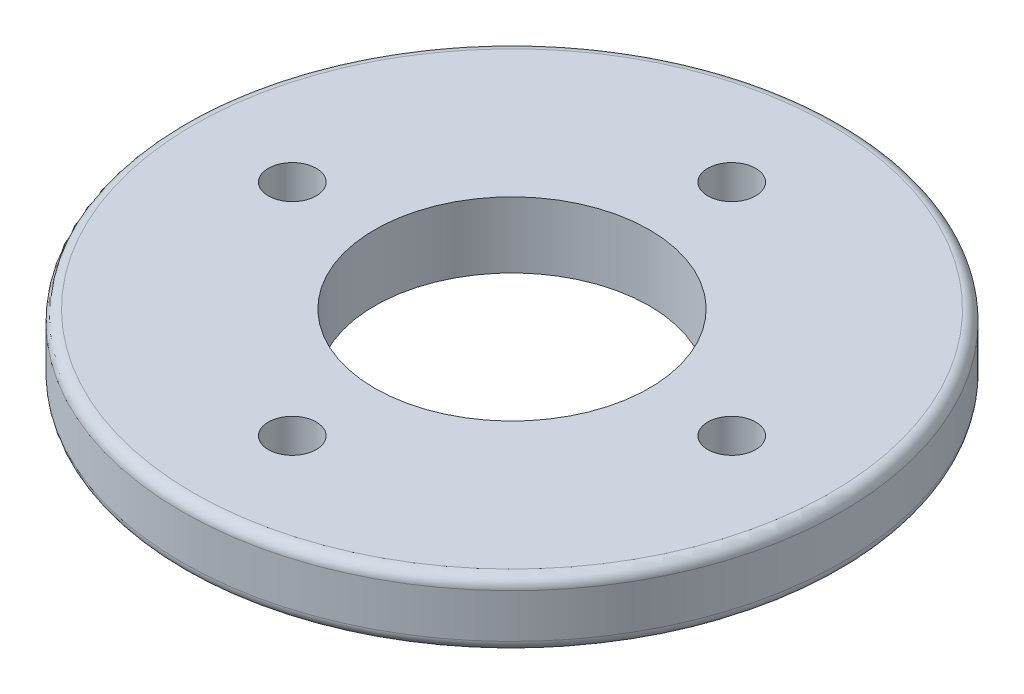
ISO-10303-21;
HEADER;
FILE_DESCRIPTION(('STEP AP214'),'2;1');
FILE_NAME('part.step','',(''),(''),'','','');
FILE_SCHEMA(('AUTOMOTIVE_DESIGN { 1 0 10303 214 1 1 1 1 }'));
ENDSEC;
DATA;
#1=APPLICATION_CONTEXT('core data for automotive mechanical design processes');
#2=APPLICATION_PROTOCOL_DEFINITION('international standard','automotive_design',2000,#1);
#3=PRODUCT_CONTEXT('',#1,'mechanical');
#4=PRODUCT('Part','Part','',(#3));
#5=PRODUCT_RELATED_PRODUCT_CATEGORY('part','',(#4));
#6=PRODUCT_DEFINITION_FORMATION('','',#4);
#7=PRODUCT_DEFINITION_CONTEXT('part definition',#1,'design');
#8=PRODUCT_DEFINITION('design','',#6,#7);
#9=PRODUCT_DEFINITION_SHAPE('','',#8);
#10=(LENGTH_UNIT() NAMED_UNIT(*) SI_UNIT(.MILLI.,.METRE.));
#11=(NAMED_UNIT(*) PLANE_ANGLE_UNIT() SI_UNIT($,.RADIAN.));
#12=(NAMED_UNIT(*) SI_UNIT($,.STERADIAN.) SOLID_ANGLE_UNIT());
#13=UNCERTAINTY_MEASURE_WITH_UNIT(LENGTH_MEASURE(1.E-05),#10,'distance_accuracy_value','');
#14=(GEOMETRIC_REPRESENTATION_CONTEXT(3) GLOBAL_UNCERTAINTY_ASSIGNED_CONTEXT((#13)) GLOBAL_UNIT_ASSIGNED_CONTEXT((#10,
#11,#12)) REPRESENTATION_CONTEXT('',''));
#15=CARTESIAN_POINT('',(0.,0.,0.));
#16=DIRECTION('',(0.,0.,1.));
#17=DIRECTION('',(1.,0.,0.));
#18=AXIS2_PLACEMENT_3D('',#15,#16,#17);
#19=CARTESIAN_POINT('',(0.,3.,0.));
#20=DIRECTION('',(0.,-1.,0.));
#21=DIRECTION('',(0.,0.,-1.));
#22=AXIS2_PLACEMENT_3D('',#19,#20,#21);
#23=CYLINDRICAL_SURFACE('',#22,15.);
#24=CARTESIAN_POINT('',(0.,0.5,0.));
#25=DIRECTION('',(0.,1.,0.));
#26=DIRECTION('',(0.,0.,1.));
#27=AXIS2_PLACEMENT_3D('',#24,#25,#26);
#28=CIRCLE('',#27,15.);
#29=CARTESIAN_POINT('',(0.,0.5,15.));
#30=VERTEX_POINT('',#29);
#31=EDGE_CURVE('E43',#30,#30,#28,.T.);
#32=ORIENTED_EDGE('',*,*,#31,.T.);
#33=EDGE_LOOP('',(#32));
#34=FACE_BOUND('',#33,.T.);
#35=CARTESIAN_POINT('',(0.,2.5,0.));
#36=DIRECTION('',(0.,1.,0.));
#37=DIRECTION('',(0.,0.,1.));
#38=AXIS2_PLACEMENT_3D('',#35,#36,#37);
#39=CIRCLE('',#38,15.);
#40=CARTESIAN_POINT('',(0.,2.5,15.));
#41=VERTEX_POINT('',#40);
#42=EDGE_CURVE('E48',#41,#41,#39,.F.);
#43=ORIENTED_EDGE('',*,*,#42,.T.);
#44=EDGE_LOOP('',(#43));
#45=FACE_BOUND('',#44,.T.);
#46=ADVANCED_FACE('F31',(#34,#45),#23,.T.);
#47=CARTESIAN_POINT('',(0.,3.,0.));
#48=DIRECTION('',(0.,1.,0.));
#49=DIRECTION('',(0.,0.,1.));
#50=AXIS2_PLACEMENT_3D('',#47,#48,#49);
#51=PLANE('',#50);
#52=CARTESIAN_POINT('',(0.,3.,0.));
#53=DIRECTION('',(0.,1.,0.));
#54=DIRECTION('',(0.,0.,1.));
#55=AXIS2_PLACEMENT_3D('',#52,#53,#54);
#56=CIRCLE('',#55,6.25);
#57=CARTESIAN_POINT('',(0.,3.,6.25));
#58=VERTEX_POINT('',#57);
#59=EDGE_CURVE('E75',#58,#58,#56,.T.);
#60=ORIENTED_EDGE('',*,*,#59,.F.);
#61=EDGE_LOOP('',(#60));
#62=FACE_BOUND('',#61,.T.);
#63=CARTESIAN_POINT('',(0.,3.,0.));
#64=DIRECTION('',(0.,1.,0.));
#65=DIRECTION('',(0.,0.,1.));
#66=AXIS2_PLACEMENT_3D('',#63,#64,#65);
#67=CIRCLE('',#66,14.5);
#68=CARTESIAN_POINT('',(0.,3.,14.5));
#69=VERTEX_POINT('',#68);
#70=EDGE_CURVE('E10',#69,#69,#67,.T.);
#71=ORIENTED_EDGE('',*,*,#70,.T.);
#72=EDGE_LOOP('',(#71));
#73=FACE_BOUND('',#72,.T.);
#74=CARTESIAN_POINT('',(10.,3.,-1.04744440165294E-13));
#75=DIRECTION('',(0.,1.,0.));
#76=DIRECTION('',(-1.,0.,0.));
#77=AXIS2_PLACEMENT_3D('',#74,#75,#76);
#78=CIRCLE('',#77,1.09);
#79=CARTESIAN_POINT('',(8.91,3.,0.));
#80=VERTEX_POINT('',#79);
#81=EDGE_CURVE('E69',#80,#80,#78,.T.);
#82=ORIENTED_EDGE('',*,*,#81,.F.);
#83=EDGE_LOOP('',(#82));
#84=FACE_BOUND('',#83,.T.);
#85=CARTESIAN_POINT('',(0.,3.,10.));
#86=DIRECTION('',(0.,1.,0.));
#87=DIRECTION('',(0.,0.,-1.));
#88=AXIS2_PLACEMENT_3D('',#85,#86,#87);
#89=CIRCLE('',#88,1.09);
#90=CARTESIAN_POINT('',(0.,3.,8.91));
#91=VERTEX_POINT('',#90);
#92=EDGE_CURVE('E63',#91,#91,#89,.T.);
#93=ORIENTED_EDGE('',*,*,#92,.F.);
#94=EDGE_LOOP('',(#93));
#95=FACE_BOUND('',#94,.T.);
#96=CARTESIAN_POINT('',(-10.,3.,0.));
#97=DIRECTION('',(0.,1.,0.));
#98=DIRECTION('',(1.,0.,0.));
#99=AXIS2_PLACEMENT_3D('',#96,#97,#98);
#100=CIRCLE('',#99,1.09);
#101=CARTESIAN_POINT('',(-8.91,3.,0.));
#102=VERTEX_POINT('',#101);
#103=EDGE_CURVE('E57',#102,#102,#100,.T.);
#104=ORIENTED_EDGE('',*,*,#103,.F.);
#105=EDGE_LOOP('',(#104));
#106=FACE_BOUND('',#105,.T.);
#107=CARTESIAN_POINT('',(0.,3.,-10.));
#108=DIRECTION('',(0.,1.,0.));
#109=DIRECTION('',(0.,0.,1.));
#110=AXIS2_PLACEMENT_3D('',#107,#108,#109);
#111=CIRCLE('',#110,1.09);
#112=CARTESIAN_POINT('',(0.,3.,-8.91));
#113=VERTEX_POINT('',#112);
#114=EDGE_CURVE('E54',#113,#113,#111,.T.);
#115=ORIENTED_EDGE('',*,*,#114,.F.);
#116=EDGE_LOOP('',(#115));
#117=FACE_BOUND('',#116,.T.);
#118=ADVANCED_FACE('F95',(#62,#73,#84,#95,#106,#117),#51,.T.);
#119=CARTESIAN_POINT('',(0.,0.,0.));
#120=DIRECTION('',(0.,1.,0.));
#121=DIRECTION('',(0.,0.,1.));
#122=AXIS2_PLACEMENT_3D('',#119,#120,#121);
#123=PLANE('',#122);
#124=CARTESIAN_POINT('',(0.,0.,0.));
#125=DIRECTION('',(0.,1.,0.));
#126=DIRECTION('',(0.,0.,1.));
#127=AXIS2_PLACEMENT_3D('',#124,#125,#126);
#128=CIRCLE('',#127,6.25);
#129=CARTESIAN_POINT('',(0.,0.,6.25));
#130=VERTEX_POINT('',#129);
#131=EDGE_CURVE('E35',#130,#130,#128,.T.);
#132=ORIENTED_EDGE('',*,*,#131,.T.);
#133=EDGE_LOOP('',(#132));
#134=FACE_BOUND('',#133,.T.);
#135=CARTESIAN_POINT('',(0.,0.,0.));
#136=DIRECTION('',(0.,1.,0.));
#137=DIRECTION('',(0.,0.,1.));
#138=AXIS2_PLACEMENT_3D('',#135,#136,#137);
#139=CIRCLE('',#138,14.5);
#140=CARTESIAN_POINT('',(0.,0.,14.5));
#141=VERTEX_POINT('',#140);
#142=EDGE_CURVE('E39',#141,#141,#139,.F.);
#143=ORIENTED_EDGE('',*,*,#142,.T.);
#144=EDGE_LOOP('',(#143));
#145=FACE_BOUND('',#144,.T.);
#146=CARTESIAN_POINT('',(10.,0.,-1.04744440165294E-13));
#147=DIRECTION('',(0.,1.,0.));
#148=DIRECTION('',(-1.,0.,0.));
#149=AXIS2_PLACEMENT_3D('',#146,#147,#148);
#150=CIRCLE('',#149,1.09);
#151=CARTESIAN_POINT('',(8.91,0.,0.));
#152=VERTEX_POINT('',#151);
#153=EDGE_CURVE('E72',#152,#152,#150,.F.);
#154=ORIENTED_EDGE('',*,*,#153,.F.);
#155=EDGE_LOOP('',(#154));
#156=FACE_BOUND('',#155,.T.);
#157=CARTESIAN_POINT('',(0.,0.,10.));
#158=DIRECTION('',(0.,1.,0.));
#159=DIRECTION('',(0.,0.,-1.));
#160=AXIS2_PLACEMENT_3D('',#157,#158,#159);
#161=CIRCLE('',#160,1.09);
#162=CARTESIAN_POINT('',(0.,0.,8.91));
#163=VERTEX_POINT('',#162);
#164=EDGE_CURVE('E66',#163,#163,#161,.F.);
#165=ORIENTED_EDGE('',*,*,#164,.F.);
#166=EDGE_LOOP('',(#165));
#167=FACE_BOUND('',#166,.T.);
#168=CARTESIAN_POINT('',(-10.,0.,0.));
#169=DIRECTION('',(0.,1.,0.));
#170=DIRECTION('',(1.,0.,0.));
#171=AXIS2_PLACEMENT_3D('',#168,#169,#170);
#172=CIRCLE('',#171,1.09);
#173=CARTESIAN_POINT('',(-8.91,0.,0.));
#174=VERTEX_POINT('',#173);
#175=EDGE_CURVE('E60',#174,#174,#172,.F.);
#176=ORIENTED_EDGE('',*,*,#175,.F.);
#177=EDGE_LOOP('',(#176));
#178=FACE_BOUND('',#177,.T.);
#179=CARTESIAN_POINT('',(0.,0.,-10.));
#180=DIRECTION('',(0.,1.,0.));
#181=DIRECTION('',(0.,0.,1.));
#182=AXIS2_PLACEMENT_3D('',#179,#180,#181);
#183=CIRCLE('',#182,1.09);
#184=CARTESIAN_POINT('',(0.,0.,-8.91));
#185=VERTEX_POINT('',#184);
#186=EDGE_CURVE('E51',#185,#185,#183,.F.);
#187=ORIENTED_EDGE('',*,*,#186,.F.);
#188=EDGE_LOOP('',(#187));
#189=FACE_BOUND('',#188,.T.);
#190=ADVANCED_FACE('F82',(#134,#145,#156,#167,#178,#189),#123,.F.);
#191=CARTESIAN_POINT('',(0.,-3.08298556597335,-10.));
#192=DIRECTION('',(0.,1.,0.));
#193=DIRECTION('',(0.,0.,1.));
#194=AXIS2_PLACEMENT_3D('',#191,#192,#193);
#195=CYLINDRICAL_SURFACE('',#194,1.09);
#196=ORIENTED_EDGE('',*,*,#186,.T.);
#197=EDGE_LOOP('',(#196));
#198=FACE_BOUND('',#197,.T.);
#199=ORIENTED_EDGE('',*,*,#114,.T.);
#200=EDGE_LOOP('',(#199));
#201=FACE_BOUND('',#200,.T.);
#202=ADVANCED_FACE('F118',(#198,#201),#195,.F.);
#203=CARTESIAN_POINT('',(-10.,-3.08298556597335,0.));
#204=DIRECTION('',(0.,1.,0.));
#205=DIRECTION('',(1.,0.,0.));
#206=AXIS2_PLACEMENT_3D('',#203,#204,#205);
#207=CYLINDRICAL_SURFACE('',#206,1.09);
#208=ORIENTED_EDGE('',*,*,#175,.T.);
#209=EDGE_LOOP('',(#208));
#210=FACE_BOUND('',#209,.T.);
#211=ORIENTED_EDGE('',*,*,#103,.T.);
#212=EDGE_LOOP('',(#211));
#213=FACE_BOUND('',#212,.T.);
#214=ADVANCED_FACE('F129',(#210,#213),#207,.F.);
#215=CARTESIAN_POINT('',(0.,-3.08298556597335,10.));
#216=DIRECTION('',(0.,1.,0.));
#217=DIRECTION('',(0.,0.,-1.));
#218=AXIS2_PLACEMENT_3D('',#215,#216,#217);
#219=CYLINDRICAL_SURFACE('',#218,1.09);
#220=ORIENTED_EDGE('',*,*,#164,.T.);
#221=EDGE_LOOP('',(#220));
#222=FACE_BOUND('',#221,.T.);
#223=ORIENTED_EDGE('',*,*,#92,.T.);
#224=EDGE_LOOP('',(#223));
#225=FACE_BOUND('',#224,.T.);
#226=ADVANCED_FACE('F111',(#222,#225),#219,.F.);
#227=CARTESIAN_POINT('',(10.,-3.08298556597335,-1.04744440165294E-13));
#228=DIRECTION('',(0.,1.,0.));
#229=DIRECTION('',(-1.,0.,0.));
#230=AXIS2_PLACEMENT_3D('',#227,#228,#229);
#231=CYLINDRICAL_SURFACE('',#230,1.09);
#232=ORIENTED_EDGE('',*,*,#153,.T.);
#233=EDGE_LOOP('',(#232));
#234=FACE_BOUND('',#233,.T.);
#235=ORIENTED_EDGE('',*,*,#81,.T.);
#236=EDGE_LOOP('',(#235));
#237=FACE_BOUND('',#236,.T.);
#238=ADVANCED_FACE('F106',(#234,#237),#231,.F.);
#239=CARTESIAN_POINT('',(0.,0.5,0.));
#240=DIRECTION('',(0.,1.,0.));
#241=DIRECTION('',(0.,0.,1.));
#242=AXIS2_PLACEMENT_3D('',#239,#240,#241);
#243=TOROIDAL_SURFACE('',#242,14.5,0.5);
#244=ORIENTED_EDGE('',*,*,#142,.F.);
#245=EDGE_LOOP('',(#244));
#246=FACE_BOUND('',#245,.T.);
#247=ORIENTED_EDGE('',*,*,#31,.F.);
#248=EDGE_LOOP('',(#247));
#249=FACE_BOUND('',#248,.T.);
#250=ADVANCED_FACE('F91',(#246,#249),#243,.T.);
#251=CARTESIAN_POINT('',(0.,2.5,0.));
#252=DIRECTION('',(0.,1.,0.));
#253=DIRECTION('',(0.,0.,1.));
#254=AXIS2_PLACEMENT_3D('',#251,#252,#253);
#255=TOROIDAL_SURFACE('',#254,14.5,0.5);
#256=ORIENTED_EDGE('',*,*,#42,.F.);
#257=EDGE_LOOP('',(#256));
#258=FACE_BOUND('',#257,.T.);
#259=ORIENTED_EDGE('',*,*,#70,.F.);
#260=EDGE_LOOP('',(#259));
#261=FACE_BOUND('',#260,.T.);
#262=ADVANCED_FACE('F33',(#258,#261),#255,.T.);
#263=CARTESIAN_POINT('',(0.,-22.,0.));
#264=DIRECTION('',(0.,1.,0.));
#265=DIRECTION('',(0.,0.,1.));
#266=AXIS2_PLACEMENT_3D('',#263,#264,#265);
#267=CYLINDRICAL_SURFACE('',#266,6.25);
#268=ORIENTED_EDGE('',*,*,#59,.T.);
#269=EDGE_LOOP('',(#268));
#270=FACE_BOUND('',#269,.T.);
#271=ORIENTED_EDGE('',*,*,#131,.F.);
#272=EDGE_LOOP('',(#271));
#273=FACE_BOUND('',#272,.T.);
#274=ADVANCED_FACE('F85',(#270,#273),#267,.F.);
#275=CLOSED_SHELL('',(#46,#118,#190,#202,#214,#226,#238,#250,#262,#274));
#276=MANIFOLD_SOLID_BREP('B2',#275);
#277=ADVANCED_BREP_SHAPE_REPRESENTATION('',(#18,#276),#14);
#278=SHAPE_DEFINITION_REPRESENTATION(#9,#277);
ENDSEC;
END-ISO-10303-21;
